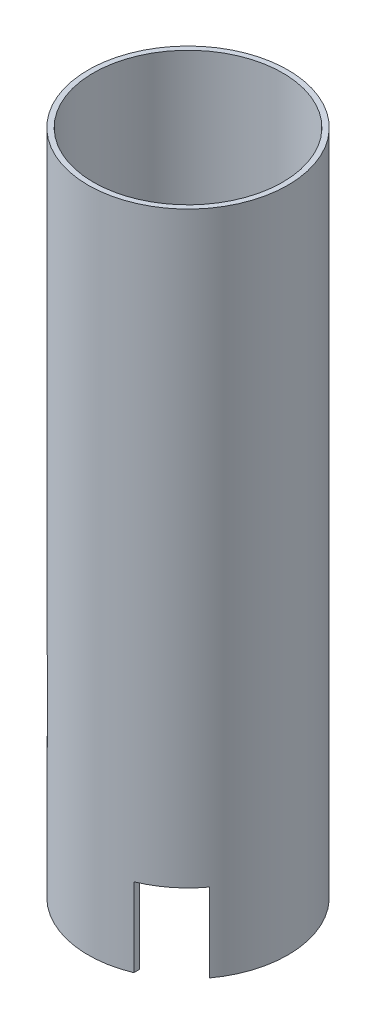
ISO-10303-21;
HEADER;
FILE_DESCRIPTION(('STEP AP214'),'2;1');
FILE_NAME('part.step','',(''),(''),'','','');
FILE_SCHEMA(('AUTOMOTIVE_DESIGN { 1 0 10303 214 1 1 1 1 }'));
ENDSEC;
DATA;
#1=APPLICATION_CONTEXT('core data for automotive mechanical design processes');
#2=APPLICATION_PROTOCOL_DEFINITION('international standard','automotive_design',2000,#1);
#3=PRODUCT_CONTEXT('',#1,'mechanical');
#4=PRODUCT('Part','Part','',(#3));
#5=PRODUCT_RELATED_PRODUCT_CATEGORY('part','',(#4));
#6=PRODUCT_DEFINITION_FORMATION('','',#4);
#7=PRODUCT_DEFINITION_CONTEXT('part definition',#1,'design');
#8=PRODUCT_DEFINITION('design','',#6,#7);
#9=PRODUCT_DEFINITION_SHAPE('','',#8);
#10=(LENGTH_UNIT() NAMED_UNIT(*) SI_UNIT(.MILLI.,.METRE.));
#11=(NAMED_UNIT(*) PLANE_ANGLE_UNIT() SI_UNIT($,.RADIAN.));
#12=(NAMED_UNIT(*) SI_UNIT($,.STERADIAN.) SOLID_ANGLE_UNIT());
#13=UNCERTAINTY_MEASURE_WITH_UNIT(LENGTH_MEASURE(1.E-05),#10,'distance_accuracy_value','');
#14=(GEOMETRIC_REPRESENTATION_CONTEXT(3) GLOBAL_UNCERTAINTY_ASSIGNED_CONTEXT((#13)) GLOBAL_UNIT_ASSIGNED_CONTEXT((#10,
#11,#12)) REPRESENTATION_CONTEXT('',''));
#15=CARTESIAN_POINT('',(0.,0.,0.));
#16=DIRECTION('',(0.,0.,1.));
#17=DIRECTION('',(1.,0.,0.));
#18=AXIS2_PLACEMENT_3D('',#15,#16,#17);
#19=CARTESIAN_POINT('',(0.,0.,0.));
#20=DIRECTION('',(0.,1.,0.));
#21=DIRECTION('',(0.,0.,1.));
#22=AXIS2_PLACEMENT_3D('',#19,#20,#21);
#23=PLANE('',#22);
#24=DIRECTION('',(0.,0.,-1.));
#25=VECTOR('',#24,1.);
#26=CARTESIAN_POINT('',(14.7017252247957,0.,0.));
#27=LINE('',#26,#25);
#28=CARTESIAN_POINT('',(14.7017252247957,0.,35.5824293073788));
#29=VERTEX_POINT('',#28);
#30=CARTESIAN_POINT('',(14.7017252247957,0.,33.4082216739324));
#31=VERTEX_POINT('',#30);
#32=EDGE_CURVE('E118',#29,#31,#27,.T.);
#33=ORIENTED_EDGE('',*,*,#32,.F.);
#34=CARTESIAN_POINT('',(0.,0.,0.));
#35=DIRECTION('',(0.,1.,0.));
#36=DIRECTION('',(0.,0.,1.));
#37=AXIS2_PLACEMENT_3D('',#34,#35,#36);
#38=CIRCLE('',#37,38.5);
#39=CARTESIAN_POINT('',(31.015912532194,0.,22.8092781515613));
#40=VERTEX_POINT('',#39);
#41=EDGE_CURVE('E116',#40,#29,#38,.T.);
#42=ORIENTED_EDGE('',*,*,#41,.F.);
#43=DIRECTION('',(0.,0.,1.));
#44=VECTOR('',#43,1.);
#45=CARTESIAN_POINT('',(31.015912532194,0.,0.));
#46=LINE('',#45,#44);
#47=CARTESIAN_POINT('',(31.015912532194,0.,19.242223618784));
#48=VERTEX_POINT('',#47);
#49=EDGE_CURVE('E106',#48,#40,#46,.T.);
#50=ORIENTED_EDGE('',*,*,#49,.F.);
#51=CARTESIAN_POINT('',(0.,0.,0.));
#52=DIRECTION('',(0.,1.,0.));
#53=DIRECTION('',(0.,0.,1.));
#54=AXIS2_PLACEMENT_3D('',#51,#52,#53);
#55=CIRCLE('',#54,36.5);
#56=EDGE_CURVE('E144',#48,#31,#55,.T.);
#57=ORIENTED_EDGE('',*,*,#56,.T.);
#58=EDGE_LOOP('',(#33,#42,#50,#57));
#59=FACE_BOUND('',#58,.T.);
#60=ADVANCED_FACE('F35',(#59),#23,.F.);
#61=CARTESIAN_POINT('',(0.,257.,0.));
#62=DIRECTION('',(0.,-1.,0.));
#63=DIRECTION('',(0.,0.,-1.));
#64=AXIS2_PLACEMENT_3D('',#61,#62,#63);
#65=CYLINDRICAL_SURFACE('',#64,38.5);
#66=CARTESIAN_POINT('',(0.,257.,0.));
#67=DIRECTION('',(0.,1.,0.));
#68=DIRECTION('',(0.,0.,1.));
#69=AXIS2_PLACEMENT_3D('',#66,#67,#68);
#70=CIRCLE('',#69,38.5);
#71=CARTESIAN_POINT('',(0.,257.,38.5));
#72=VERTEX_POINT('',#71);
#73=EDGE_CURVE('E150',#72,#72,#70,.T.);
#74=ORIENTED_EDGE('',*,*,#73,.F.);
#75=EDGE_LOOP('',(#74));
#76=FACE_BOUND('',#75,.T.);
#77=CARTESIAN_POINT('',(0.,51.7956823867146,0.));
#78=DIRECTION('',(0.,-1.,0.));
#79=DIRECTION('',(0.,0.,-1.));
#80=AXIS2_PLACEMENT_3D('',#77,#78,#79);
#81=CIRCLE('',#80,38.5);
#82=CARTESIAN_POINT('',(-23.9945370065122,51.7956823867145,30.1083409347495));
#83=VERTEX_POINT('',#82);
#84=CARTESIAN_POINT('',(-37.4070598338919,51.7956823867146,9.10834093474953));
#85=VERTEX_POINT('',#84);
#86=EDGE_CURVE('E138',#83,#85,#81,.T.);
#87=ORIENTED_EDGE('',*,*,#86,.T.);
#88=DIRECTION('',(0.,-1.,0.));
#89=VECTOR('',#88,1.);
#90=CARTESIAN_POINT('',(-37.4070598338919,257.,9.10834093474955));
#91=LINE('',#90,#89);
#92=CARTESIAN_POINT('',(-37.4070598338919,82.7956823867145,9.10834093474953));
#93=VERTEX_POINT('',#92);
#94=EDGE_CURVE('E141',#85,#93,#91,.F.);
#95=ORIENTED_EDGE('',*,*,#94,.T.);
#96=CARTESIAN_POINT('',(0.,82.7956823867145,0.));
#97=DIRECTION('',(0.,1.,0.));
#98=DIRECTION('',(0.,0.,1.));
#99=AXIS2_PLACEMENT_3D('',#96,#97,#98);
#100=CIRCLE('',#99,38.5);
#101=CARTESIAN_POINT('',(-23.9945370065122,82.7956823867145,30.1083409347495));
#102=VERTEX_POINT('',#101);
#103=EDGE_CURVE('E128',#93,#102,#100,.T.);
#104=ORIENTED_EDGE('',*,*,#103,.T.);
#105=DIRECTION('',(0.,-1.,0.));
#106=VECTOR('',#105,1.);
#107=CARTESIAN_POINT('',(-23.9945370065122,257.,30.1083409347496));
#108=LINE('',#107,#106);
#109=EDGE_CURVE('E135',#102,#83,#108,.T.);
#110=ORIENTED_EDGE('',*,*,#109,.T.);
#111=EDGE_LOOP('',(#87,#95,#104,#110));
#112=FACE_BOUND('',#111,.T.);
#113=DIRECTION('',(0.,-1.,0.));
#114=VECTOR('',#113,1.);
#115=CARTESIAN_POINT('',(14.7017252247957,257.,35.5824293073788));
#116=LINE('',#115,#114);
#117=CARTESIAN_POINT('',(14.7017252247957,30.3507224674471,35.5824293073788));
#118=VERTEX_POINT('',#117);
#119=EDGE_CURVE('E110',#118,#29,#116,.T.);
#120=ORIENTED_EDGE('',*,*,#119,.F.);
#121=CARTESIAN_POINT('',(0.,30.3507224674471,0.));
#122=DIRECTION('',(0.,-1.,0.));
#123=DIRECTION('',(0.,0.,-1.));
#124=AXIS2_PLACEMENT_3D('',#121,#122,#123);
#125=CIRCLE('',#124,38.5);
#126=CARTESIAN_POINT('',(31.015912532194,30.3507224674471,22.8092781515613));
#127=VERTEX_POINT('',#126);
#128=EDGE_CURVE('E99',#127,#118,#125,.T.);
#129=ORIENTED_EDGE('',*,*,#128,.F.);
#130=DIRECTION('',(0.,-1.,0.));
#131=VECTOR('',#130,1.);
#132=CARTESIAN_POINT('',(31.015912532194,257.,22.8092781515613));
#133=LINE('',#132,#131);
#134=EDGE_CURVE('E121',#40,#127,#133,.F.);
#135=ORIENTED_EDGE('',*,*,#134,.F.);
#136=ORIENTED_EDGE('',*,*,#41,.T.);
#137=EDGE_LOOP('',(#120,#129,#135,#136));
#138=FACE_BOUND('',#137,.T.);
#139=ADVANCED_FACE('F37',(#76,#112,#138),#65,.T.);
#140=CARTESIAN_POINT('',(0.,257.,0.));
#141=DIRECTION('',(0.,-1.,0.));
#142=DIRECTION('',(0.,0.,-1.));
#143=AXIS2_PLACEMENT_3D('',#140,#141,#142);
#144=CYLINDRICAL_SURFACE('',#143,36.5);
#145=DIRECTION('',(0.,-1.,0.));
#146=VECTOR('',#145,1.);
#147=CARTESIAN_POINT('',(-35.3452701986612,257.,9.10834093474955));
#148=LINE('',#147,#146);
#149=CARTESIAN_POINT('',(-35.3452701986612,51.7956823867146,9.10834093474953));
#150=VERTEX_POINT('',#149);
#151=CARTESIAN_POINT('',(-35.3452701986612,82.7956823867145,9.10834093474953));
#152=VERTEX_POINT('',#151);
#153=EDGE_CURVE('E160',#150,#152,#148,.F.);
#154=ORIENTED_EDGE('',*,*,#153,.F.);
#155=CARTESIAN_POINT('',(0.,51.7956823867146,0.));
#156=DIRECTION('',(0.,-1.,0.));
#157=DIRECTION('',(0.,0.,-1.));
#158=AXIS2_PLACEMENT_3D('',#155,#156,#157);
#159=CIRCLE('',#158,36.5);
#160=CARTESIAN_POINT('',(-20.6334147963173,51.7956823867145,30.1083409347495));
#161=VERTEX_POINT('',#160);
#162=EDGE_CURVE('E158',#161,#150,#159,.T.);
#163=ORIENTED_EDGE('',*,*,#162,.F.);
#164=DIRECTION('',(0.,-1.,0.));
#165=VECTOR('',#164,1.);
#166=CARTESIAN_POINT('',(-20.6334147963173,257.,30.1083409347496));
#167=LINE('',#166,#165);
#168=CARTESIAN_POINT('',(-20.6334147963173,82.7956823867145,30.1083409347495));
#169=VERTEX_POINT('',#168);
#170=EDGE_CURVE('E156',#169,#161,#167,.T.);
#171=ORIENTED_EDGE('',*,*,#170,.F.);
#172=CARTESIAN_POINT('',(0.,82.7956823867145,0.));
#173=DIRECTION('',(0.,1.,0.));
#174=DIRECTION('',(0.,0.,1.));
#175=AXIS2_PLACEMENT_3D('',#172,#173,#174);
#176=CIRCLE('',#175,36.5);
#177=EDGE_CURVE('E153',#152,#169,#176,.T.);
#178=ORIENTED_EDGE('',*,*,#177,.F.);
#179=EDGE_LOOP('',(#154,#163,#171,#178));
#180=FACE_BOUND('',#179,.T.);
#181=CARTESIAN_POINT('',(0.,257.,0.));
#182=DIRECTION('',(0.,1.,0.));
#183=DIRECTION('',(0.,0.,1.));
#184=AXIS2_PLACEMENT_3D('',#181,#182,#183);
#185=CIRCLE('',#184,36.5);
#186=CARTESIAN_POINT('',(0.,257.,36.5));
#187=VERTEX_POINT('',#186);
#188=EDGE_CURVE('E145',#187,#187,#185,.T.);
#189=ORIENTED_EDGE('',*,*,#188,.T.);
#190=EDGE_LOOP('',(#189));
#191=FACE_BOUND('',#190,.T.);
#192=CARTESIAN_POINT('',(0.,30.3507224674471,0.));
#193=DIRECTION('',(0.,-1.,0.));
#194=DIRECTION('',(0.,0.,-1.));
#195=AXIS2_PLACEMENT_3D('',#192,#193,#194);
#196=CIRCLE('',#195,36.5);
#197=CARTESIAN_POINT('',(31.015912532194,30.3507224674471,19.242223618784));
#198=VERTEX_POINT('',#197);
#199=CARTESIAN_POINT('',(14.7017252247957,30.3507224674471,33.4082216739324));
#200=VERTEX_POINT('',#199);
#201=EDGE_CURVE('E163',#198,#200,#196,.T.);
#202=ORIENTED_EDGE('',*,*,#201,.T.);
#203=DIRECTION('',(0.,-1.,0.));
#204=VECTOR('',#203,1.);
#205=CARTESIAN_POINT('',(14.7017252247957,257.,33.4082216739324));
#206=LINE('',#205,#204);
#207=EDGE_CURVE('E11',#200,#31,#206,.T.);
#208=ORIENTED_EDGE('',*,*,#207,.T.);
#209=ORIENTED_EDGE('',*,*,#56,.F.);
#210=DIRECTION('',(0.,-1.,0.));
#211=VECTOR('',#210,1.);
#212=CARTESIAN_POINT('',(31.015912532194,257.,19.242223618784));
#213=LINE('',#212,#211);
#214=EDGE_CURVE('E43',#48,#198,#213,.F.);
#215=ORIENTED_EDGE('',*,*,#214,.T.);
#216=EDGE_LOOP('',(#202,#208,#209,#215));
#217=FACE_BOUND('',#216,.T.);
#218=ADVANCED_FACE('F167',(#180,#191,#217),#144,.F.);
#219=CARTESIAN_POINT('',(0.,257.,0.));
#220=DIRECTION('',(0.,1.,0.));
#221=DIRECTION('',(0.,0.,1.));
#222=AXIS2_PLACEMENT_3D('',#219,#220,#221);
#223=PLANE('',#222);
#224=ORIENTED_EDGE('',*,*,#73,.T.);
#225=EDGE_LOOP('',(#224));
#226=FACE_BOUND('',#225,.T.);
#227=ORIENTED_EDGE('',*,*,#188,.F.);
#228=EDGE_LOOP('',(#227));
#229=FACE_BOUND('',#228,.T.);
#230=ADVANCED_FACE('F181',(#226,#229),#223,.T.);
#231=CARTESIAN_POINT('',(-50.,82.7956823867145,9.10834093474953));
#232=DIRECTION('',(0.,0.,-1.));
#233=DIRECTION('',(0.,1.,0.));
#234=AXIS2_PLACEMENT_3D('',#231,#232,#233);
#235=PLANE('',#234);
#236=DIRECTION('',(1.,0.,0.));
#237=VECTOR('',#236,1.);
#238=CARTESIAN_POINT('',(-50.,51.7956823867145,9.10834093474953));
#239=LINE('',#238,#237);
#240=EDGE_CURVE('E125',#85,#150,#239,.T.);
#241=ORIENTED_EDGE('',*,*,#240,.T.);
#242=ORIENTED_EDGE('',*,*,#153,.T.);
#243=DIRECTION('',(1.,0.,0.));
#244=VECTOR('',#243,1.);
#245=CARTESIAN_POINT('',(-50.,82.7956823867145,9.10834093474953));
#246=LINE('',#245,#244);
#247=EDGE_CURVE('E117',#93,#152,#246,.T.);
#248=ORIENTED_EDGE('',*,*,#247,.F.);
#249=ORIENTED_EDGE('',*,*,#94,.F.);
#250=EDGE_LOOP('',(#241,#242,#248,#249));
#251=FACE_BOUND('',#250,.T.);
#252=ADVANCED_FACE('F184',(#251),#235,.F.);
#253=CARTESIAN_POINT('',(-50.,51.7956823867145,9.10834093474953));
#254=DIRECTION('',(0.,-1.,0.));
#255=DIRECTION('',(0.,0.,-1.));
#256=AXIS2_PLACEMENT_3D('',#253,#254,#255);
#257=PLANE('',#256);
#258=DIRECTION('',(1.,0.,0.));
#259=VECTOR('',#258,1.);
#260=CARTESIAN_POINT('',(-50.,51.7956823867145,30.1083409347495));
#261=LINE('',#260,#259);
#262=EDGE_CURVE('E129',#83,#161,#261,.T.);
#263=ORIENTED_EDGE('',*,*,#262,.T.);
#264=ORIENTED_EDGE('',*,*,#162,.T.);
#265=ORIENTED_EDGE('',*,*,#240,.F.);
#266=ORIENTED_EDGE('',*,*,#86,.F.);
#267=EDGE_LOOP('',(#263,#264,#265,#266));
#268=FACE_BOUND('',#267,.T.);
#269=ADVANCED_FACE('F191',(#268),#257,.F.);
#270=CARTESIAN_POINT('',(-50.,82.7956823867145,30.1083409347495));
#271=DIRECTION('',(0.,0.,1.));
#272=DIRECTION('',(0.,-1.,0.));
#273=AXIS2_PLACEMENT_3D('',#270,#271,#272);
#274=PLANE('',#273);
#275=DIRECTION('',(1.,0.,0.));
#276=VECTOR('',#275,1.);
#277=CARTESIAN_POINT('',(-50.,82.7956823867145,30.1083409347495));
#278=LINE('',#277,#276);
#279=EDGE_CURVE('E58',#102,#169,#278,.T.);
#280=ORIENTED_EDGE('',*,*,#279,.T.);
#281=ORIENTED_EDGE('',*,*,#170,.T.);
#282=ORIENTED_EDGE('',*,*,#262,.F.);
#283=ORIENTED_EDGE('',*,*,#109,.F.);
#284=EDGE_LOOP('',(#280,#281,#282,#283));
#285=FACE_BOUND('',#284,.T.);
#286=ADVANCED_FACE('F196',(#285),#274,.F.);
#287=CARTESIAN_POINT('',(-50.,82.7956823867145,9.10834093474953));
#288=DIRECTION('',(0.,1.,0.));
#289=DIRECTION('',(0.,0.,1.));
#290=AXIS2_PLACEMENT_3D('',#287,#288,#289);
#291=PLANE('',#290);
#292=ORIENTED_EDGE('',*,*,#247,.T.);
#293=ORIENTED_EDGE('',*,*,#177,.T.);
#294=ORIENTED_EDGE('',*,*,#279,.F.);
#295=ORIENTED_EDGE('',*,*,#103,.F.);
#296=EDGE_LOOP('',(#292,#293,#294,#295));
#297=FACE_BOUND('',#296,.T.);
#298=ADVANCED_FACE('F193',(#297),#291,.F.);
#299=CARTESIAN_POINT('',(14.7017252247957,30.3507224674471,40.));
#300=DIRECTION('',(1.,0.,0.));
#301=DIRECTION('',(0.,0.,-1.));
#302=AXIS2_PLACEMENT_3D('',#299,#300,#301);
#303=PLANE('',#302);
#304=ORIENTED_EDGE('',*,*,#119,.T.);
#305=ORIENTED_EDGE('',*,*,#32,.T.);
#306=ORIENTED_EDGE('',*,*,#207,.F.);
#307=DIRECTION('',(0.,0.,-1.));
#308=VECTOR('',#307,1.);
#309=CARTESIAN_POINT('',(14.7017252247957,30.3507224674471,40.));
#310=LINE('',#309,#308);
#311=EDGE_CURVE('E50',#118,#200,#310,.T.);
#312=ORIENTED_EDGE('',*,*,#311,.F.);
#313=EDGE_LOOP('',(#304,#305,#306,#312));
#314=FACE_BOUND('',#313,.T.);
#315=ADVANCED_FACE('F109',(#314),#303,.T.);
#316=CARTESIAN_POINT('',(31.015912532194,30.3507224674471,40.));
#317=DIRECTION('',(-1.,0.,0.));
#318=DIRECTION('',(0.,0.,1.));
#319=AXIS2_PLACEMENT_3D('',#316,#317,#318);
#320=PLANE('',#319);
#321=ORIENTED_EDGE('',*,*,#134,.T.);
#322=DIRECTION('',(0.,0.,-1.));
#323=VECTOR('',#322,1.);
#324=CARTESIAN_POINT('',(31.015912532194,30.3507224674471,40.));
#325=LINE('',#324,#323);
#326=EDGE_CURVE('E102',#127,#198,#325,.T.);
#327=ORIENTED_EDGE('',*,*,#326,.T.);
#328=ORIENTED_EDGE('',*,*,#214,.F.);
#329=ORIENTED_EDGE('',*,*,#49,.T.);
#330=EDGE_LOOP('',(#321,#327,#328,#329));
#331=FACE_BOUND('',#330,.T.);
#332=ADVANCED_FACE('F170',(#331),#320,.T.);
#333=CARTESIAN_POINT('',(14.7017252247957,30.3507224674471,40.));
#334=DIRECTION('',(0.,-1.,0.));
#335=DIRECTION('',(0.,0.,-1.));
#336=AXIS2_PLACEMENT_3D('',#333,#334,#335);
#337=PLANE('',#336);
#338=ORIENTED_EDGE('',*,*,#128,.T.);
#339=ORIENTED_EDGE('',*,*,#311,.T.);
#340=ORIENTED_EDGE('',*,*,#201,.F.);
#341=ORIENTED_EDGE('',*,*,#326,.F.);
#342=EDGE_LOOP('',(#338,#339,#340,#341));
#343=FACE_BOUND('',#342,.T.);
#344=ADVANCED_FACE('F100',(#343),#337,.T.);
#345=CLOSED_SHELL('',(#60,#139,#218,#230,#252,#269,#286,#298,#315,#332,#344));
#346=MANIFOLD_SOLID_BREP('B2',#345);
#347=ADVANCED_BREP_SHAPE_REPRESENTATION('',(#18,#346),#14);
#348=SHAPE_DEFINITION_REPRESENTATION(#9,#347);
ENDSEC;
END-ISO-10303-21;
